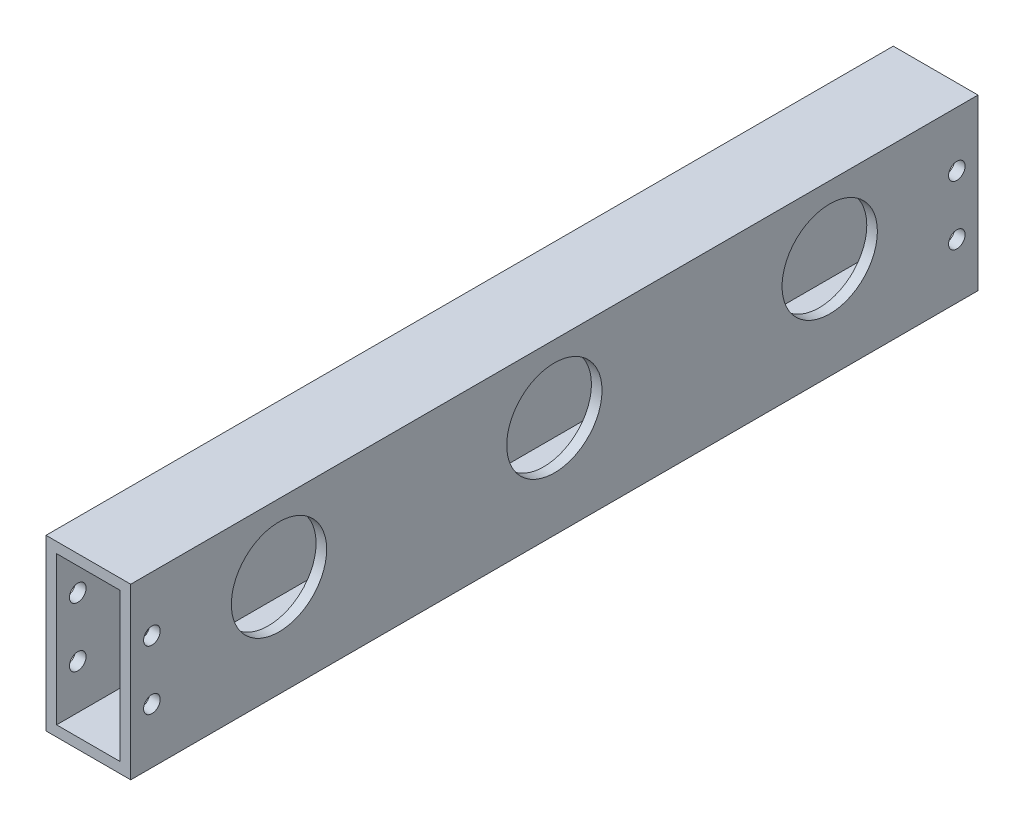
ISO-10303-21;
HEADER;
FILE_DESCRIPTION(('STEP AP214'),'2;1');
FILE_NAME('part.step','',(''),(''),'','','');
FILE_SCHEMA(('AUTOMOTIVE_DESIGN { 1 0 10303 214 1 1 1 1 }'));
ENDSEC;
DATA;
#1=APPLICATION_CONTEXT('core data for automotive mechanical design processes');
#2=APPLICATION_PROTOCOL_DEFINITION('international standard','automotive_design',2000,#1);
#3=PRODUCT_CONTEXT('',#1,'mechanical');
#4=PRODUCT('Part','Part','',(#3));
#5=PRODUCT_RELATED_PRODUCT_CATEGORY('part','',(#4));
#6=PRODUCT_DEFINITION_FORMATION('','',#4);
#7=PRODUCT_DEFINITION_CONTEXT('part definition',#1,'design');
#8=PRODUCT_DEFINITION('design','',#6,#7);
#9=PRODUCT_DEFINITION_SHAPE('','',#8);
#10=(LENGTH_UNIT() NAMED_UNIT(*) SI_UNIT(.MILLI.,.METRE.));
#11=(NAMED_UNIT(*) PLANE_ANGLE_UNIT() SI_UNIT($,.RADIAN.));
#12=(NAMED_UNIT(*) SI_UNIT($,.STERADIAN.) SOLID_ANGLE_UNIT());
#13=UNCERTAINTY_MEASURE_WITH_UNIT(LENGTH_MEASURE(1.E-05),#10,'distance_accuracy_value','');
#14=(GEOMETRIC_REPRESENTATION_CONTEXT(3) GLOBAL_UNCERTAINTY_ASSIGNED_CONTEXT((#13)) GLOBAL_UNIT_ASSIGNED_CONTEXT((#10,
#11,#12)) REPRESENTATION_CONTEXT('',''));
#15=CARTESIAN_POINT('',(0.,0.,0.));
#16=DIRECTION('',(0.,0.,1.));
#17=DIRECTION('',(1.,0.,0.));
#18=AXIS2_PLACEMENT_3D('',#15,#16,#17);
#19=CARTESIAN_POINT('',(25.4,25.4,-127.));
#20=DIRECTION('',(0.,0.,1.));
#21=DIRECTION('',(1.,0.,0.));
#22=AXIS2_PLACEMENT_3D('',#19,#20,#21);
#23=PLANE('',#22);
#24=DIRECTION('',(0.,1.,0.));
#25=VECTOR('',#24,1.);
#26=CARTESIAN_POINT('',(0.,25.4,-127.));
#27=LINE('',#26,#25);
#28=CARTESIAN_POINT('',(0.,-25.4,-127.));
#29=VERTEX_POINT('',#28);
#30=CARTESIAN_POINT('',(0.,25.4,-127.));
#31=VERTEX_POINT('',#30);
#32=EDGE_CURVE('E149',#29,#31,#27,.T.);
#33=ORIENTED_EDGE('',*,*,#32,.T.);
#34=DIRECTION('',(-1.,0.,0.));
#35=VECTOR('',#34,1.);
#36=CARTESIAN_POINT('',(25.4,25.4,-127.));
#37=LINE('',#36,#35);
#38=CARTESIAN_POINT('',(25.4,25.4,-127.));
#39=VERTEX_POINT('',#38);
#40=EDGE_CURVE('E11',#39,#31,#37,.T.);
#41=ORIENTED_EDGE('',*,*,#40,.F.);
#42=DIRECTION('',(0.,1.,0.));
#43=VECTOR('',#42,1.);
#44=CARTESIAN_POINT('',(25.4,25.4,-127.));
#45=LINE('',#44,#43);
#46=CARTESIAN_POINT('',(25.4,-25.4,-127.));
#47=VERTEX_POINT('',#46);
#48=EDGE_CURVE('E158',#47,#39,#45,.T.);
#49=ORIENTED_EDGE('',*,*,#48,.F.);
#50=DIRECTION('',(-1.,0.,0.));
#51=VECTOR('',#50,1.);
#52=CARTESIAN_POINT('',(25.4,-25.4,-127.));
#53=LINE('',#52,#51);
#54=EDGE_CURVE('E172',#47,#29,#53,.T.);
#55=ORIENTED_EDGE('',*,*,#54,.T.);
#56=EDGE_LOOP('',(#33,#41,#49,#55));
#57=FACE_BOUND('',#56,.T.);
#58=DIRECTION('',(0.,1.,0.));
#59=VECTOR('',#58,1.);
#60=CARTESIAN_POINT('',(3.175,25.4,-127.));
#61=LINE('',#60,#59);
#62=CARTESIAN_POINT('',(3.175,-22.225,-127.));
#63=VERTEX_POINT('',#62);
#64=CARTESIAN_POINT('',(3.175,22.225,-127.));
#65=VERTEX_POINT('',#64);
#66=EDGE_CURVE('E118',#63,#65,#61,.T.);
#67=ORIENTED_EDGE('',*,*,#66,.F.);
#68=DIRECTION('',(-1.,0.,0.));
#69=VECTOR('',#68,1.);
#70=CARTESIAN_POINT('',(25.4,-22.225,-127.));
#71=LINE('',#70,#69);
#72=CARTESIAN_POINT('',(22.225,-22.225,-127.));
#73=VERTEX_POINT('',#72);
#74=EDGE_CURVE('E143',#73,#63,#71,.T.);
#75=ORIENTED_EDGE('',*,*,#74,.F.);
#76=DIRECTION('',(0.,1.,0.));
#77=VECTOR('',#76,1.);
#78=CARTESIAN_POINT('',(22.225,25.4,-127.));
#79=LINE('',#78,#77);
#80=CARTESIAN_POINT('',(22.225,22.225,-127.));
#81=VERTEX_POINT('',#80);
#82=EDGE_CURVE('E62',#73,#81,#79,.T.);
#83=ORIENTED_EDGE('',*,*,#82,.T.);
#84=DIRECTION('',(-1.,0.,0.));
#85=VECTOR('',#84,1.);
#86=CARTESIAN_POINT('',(25.4,22.225,-127.));
#87=LINE('',#86,#85);
#88=EDGE_CURVE('E130',#81,#65,#87,.T.);
#89=ORIENTED_EDGE('',*,*,#88,.T.);
#90=EDGE_LOOP('',(#67,#75,#83,#89));
#91=FACE_BOUND('',#90,.T.);
#92=ADVANCED_FACE('F45',(#57,#91),#23,.F.);
#93=CARTESIAN_POINT('',(25.4,25.4,127.));
#94=DIRECTION('',(0.,0.,-1.));
#95=DIRECTION('',(-1.,0.,0.));
#96=AXIS2_PLACEMENT_3D('',#93,#94,#95);
#97=PLANE('',#96);
#98=DIRECTION('',(0.,-1.,0.));
#99=VECTOR('',#98,1.);
#100=CARTESIAN_POINT('',(0.,25.4,127.));
#101=LINE('',#100,#99);
#102=CARTESIAN_POINT('',(0.,25.4,127.));
#103=VERTEX_POINT('',#102);
#104=CARTESIAN_POINT('',(0.,-25.4,127.));
#105=VERTEX_POINT('',#104);
#106=EDGE_CURVE('E179',#103,#105,#101,.T.);
#107=ORIENTED_EDGE('',*,*,#106,.T.);
#108=DIRECTION('',(-1.,0.,0.));
#109=VECTOR('',#108,1.);
#110=CARTESIAN_POINT('',(25.4,-25.4,127.));
#111=LINE('',#110,#109);
#112=CARTESIAN_POINT('',(25.4,-25.4,127.));
#113=VERTEX_POINT('',#112);
#114=EDGE_CURVE('E187',#113,#105,#111,.T.);
#115=ORIENTED_EDGE('',*,*,#114,.F.);
#116=DIRECTION('',(0.,-1.,0.));
#117=VECTOR('',#116,1.);
#118=CARTESIAN_POINT('',(25.4,25.4,127.));
#119=LINE('',#118,#117);
#120=CARTESIAN_POINT('',(25.4,25.4,127.));
#121=VERTEX_POINT('',#120);
#122=EDGE_CURVE('E166',#121,#113,#119,.T.);
#123=ORIENTED_EDGE('',*,*,#122,.F.);
#124=DIRECTION('',(-1.,0.,0.));
#125=VECTOR('',#124,1.);
#126=CARTESIAN_POINT('',(25.4,25.4,127.));
#127=LINE('',#126,#125);
#128=EDGE_CURVE('E54',#121,#103,#127,.T.);
#129=ORIENTED_EDGE('',*,*,#128,.T.);
#130=EDGE_LOOP('',(#107,#115,#123,#129));
#131=FACE_BOUND('',#130,.T.);
#132=DIRECTION('',(0.,-1.,0.));
#133=VECTOR('',#132,1.);
#134=CARTESIAN_POINT('',(3.175,25.4,127.));
#135=LINE('',#134,#133);
#136=CARTESIAN_POINT('',(3.175,22.225,127.));
#137=VERTEX_POINT('',#136);
#138=CARTESIAN_POINT('',(3.175,-22.225,127.));
#139=VERTEX_POINT('',#138);
#140=EDGE_CURVE('E115',#137,#139,#135,.T.);
#141=ORIENTED_EDGE('',*,*,#140,.F.);
#142=DIRECTION('',(-1.,0.,0.));
#143=VECTOR('',#142,1.);
#144=CARTESIAN_POINT('',(25.4,22.225,127.));
#145=LINE('',#144,#143);
#146=CARTESIAN_POINT('',(22.225,22.225,127.));
#147=VERTEX_POINT('',#146);
#148=EDGE_CURVE('E125',#147,#137,#145,.T.);
#149=ORIENTED_EDGE('',*,*,#148,.F.);
#150=DIRECTION('',(0.,-1.,0.));
#151=VECTOR('',#150,1.);
#152=CARTESIAN_POINT('',(22.225,25.4,127.));
#153=LINE('',#152,#151);
#154=CARTESIAN_POINT('',(22.225,-22.225,127.));
#155=VERTEX_POINT('',#154);
#156=EDGE_CURVE('E67',#147,#155,#153,.T.);
#157=ORIENTED_EDGE('',*,*,#156,.T.);
#158=DIRECTION('',(-1.,0.,0.));
#159=VECTOR('',#158,1.);
#160=CARTESIAN_POINT('',(25.4,-22.225,127.));
#161=LINE('',#160,#159);
#162=EDGE_CURVE('E131',#155,#139,#161,.T.);
#163=ORIENTED_EDGE('',*,*,#162,.T.);
#164=EDGE_LOOP('',(#141,#149,#157,#163));
#165=FACE_BOUND('',#164,.T.);
#166=ADVANCED_FACE('F134',(#131,#165),#97,.F.);
#167=CARTESIAN_POINT('',(25.4,25.4,127.));
#168=DIRECTION('',(0.,-1.,0.));
#169=DIRECTION('',(0.,0.,-1.));
#170=AXIS2_PLACEMENT_3D('',#167,#168,#169);
#171=PLANE('',#170);
#172=DIRECTION('',(0.,0.,1.));
#173=VECTOR('',#172,1.);
#174=CARTESIAN_POINT('',(0.,25.4,127.));
#175=LINE('',#174,#173);
#176=EDGE_CURVE('E176',#31,#103,#175,.T.);
#177=ORIENTED_EDGE('',*,*,#176,.T.);
#178=ORIENTED_EDGE('',*,*,#128,.F.);
#179=DIRECTION('',(0.,0.,1.));
#180=VECTOR('',#179,1.);
#181=CARTESIAN_POINT('',(25.4,25.4,127.));
#182=LINE('',#181,#180);
#183=EDGE_CURVE('E162',#39,#121,#182,.T.);
#184=ORIENTED_EDGE('',*,*,#183,.F.);
#185=ORIENTED_EDGE('',*,*,#40,.T.);
#186=EDGE_LOOP('',(#177,#178,#184,#185));
#187=FACE_BOUND('',#186,.T.);
#188=ADVANCED_FACE('F306',(#187),#171,.F.);
#189=CARTESIAN_POINT('',(25.4,-25.4,127.));
#190=DIRECTION('',(0.,1.,0.));
#191=DIRECTION('',(0.,0.,1.));
#192=AXIS2_PLACEMENT_3D('',#189,#190,#191);
#193=PLANE('',#192);
#194=DIRECTION('',(0.,0.,-1.));
#195=VECTOR('',#194,1.);
#196=CARTESIAN_POINT('',(0.,-25.4,127.));
#197=LINE('',#196,#195);
#198=EDGE_CURVE('E163',#105,#29,#197,.T.);
#199=ORIENTED_EDGE('',*,*,#198,.T.);
#200=ORIENTED_EDGE('',*,*,#54,.F.);
#201=DIRECTION('',(0.,0.,-1.));
#202=VECTOR('',#201,1.);
#203=CARTESIAN_POINT('',(25.4,-25.4,127.));
#204=LINE('',#203,#202);
#205=EDGE_CURVE('E169',#113,#47,#204,.T.);
#206=ORIENTED_EDGE('',*,*,#205,.F.);
#207=ORIENTED_EDGE('',*,*,#114,.T.);
#208=EDGE_LOOP('',(#199,#200,#206,#207));
#209=FACE_BOUND('',#208,.T.);
#210=ADVANCED_FACE('F325',(#209),#193,.F.);
#211=CARTESIAN_POINT('',(25.4,0.,0.));
#212=DIRECTION('',(1.,0.,0.));
#213=DIRECTION('',(0.,0.,-1.));
#214=AXIS2_PLACEMENT_3D('',#211,#212,#213);
#215=PLANE('',#214);
#216=CARTESIAN_POINT('',(25.4,8.89,-120.65));
#217=DIRECTION('',(1.,0.,0.));
#218=DIRECTION('',(0.,0.,-1.));
#219=AXIS2_PLACEMENT_3D('',#216,#217,#218);
#220=CIRCLE('',#219,2.4892);
#221=CARTESIAN_POINT('',(25.4,8.89,-123.1392));
#222=VERTEX_POINT('',#221);
#223=EDGE_CURVE('E395',#222,#222,#220,.T.);
#224=ORIENTED_EDGE('',*,*,#223,.F.);
#225=EDGE_LOOP('',(#224));
#226=FACE_BOUND('',#225,.T.);
#227=CARTESIAN_POINT('',(25.4,-8.89,-120.65));
#228=DIRECTION('',(1.,0.,0.));
#229=DIRECTION('',(0.,0.,-1.));
#230=AXIS2_PLACEMENT_3D('',#227,#228,#229);
#231=CIRCLE('',#230,2.4892);
#232=CARTESIAN_POINT('',(25.4,-8.89,-123.1392));
#233=VERTEX_POINT('',#232);
#234=EDGE_CURVE('E227',#233,#233,#231,.T.);
#235=ORIENTED_EDGE('',*,*,#234,.F.);
#236=EDGE_LOOP('',(#235));
#237=FACE_BOUND('',#236,.T.);
#238=CARTESIAN_POINT('',(25.4,8.89,120.65));
#239=DIRECTION('',(1.,0.,0.));
#240=DIRECTION('',(0.,0.,-1.));
#241=AXIS2_PLACEMENT_3D('',#238,#239,#240);
#242=CIRCLE('',#241,2.4892);
#243=CARTESIAN_POINT('',(25.4,8.89,118.1608));
#244=VERTEX_POINT('',#243);
#245=EDGE_CURVE('E224',#244,#244,#242,.T.);
#246=ORIENTED_EDGE('',*,*,#245,.F.);
#247=EDGE_LOOP('',(#246));
#248=FACE_BOUND('',#247,.T.);
#249=CARTESIAN_POINT('',(25.4,-8.89,120.65));
#250=DIRECTION('',(1.,0.,0.));
#251=DIRECTION('',(0.,0.,-1.));
#252=AXIS2_PLACEMENT_3D('',#249,#250,#251);
#253=CIRCLE('',#252,2.4892);
#254=CARTESIAN_POINT('',(25.4,-8.89,118.1608));
#255=VERTEX_POINT('',#254);
#256=EDGE_CURVE('E246',#255,#255,#253,.T.);
#257=ORIENTED_EDGE('',*,*,#256,.F.);
#258=EDGE_LOOP('',(#257));
#259=FACE_BOUND('',#258,.T.);
#260=CARTESIAN_POINT('',(25.4,5.08,-82.55));
#261=DIRECTION('',(1.,0.,0.));
#262=DIRECTION('',(0.,0.,-1.));
#263=AXIS2_PLACEMENT_3D('',#260,#261,#262);
#264=CIRCLE('',#263,14.2875);
#265=CARTESIAN_POINT('',(25.4,5.08,-96.8375));
#266=VERTEX_POINT('',#265);
#267=EDGE_CURVE('E272',#266,#266,#264,.T.);
#268=ORIENTED_EDGE('',*,*,#267,.F.);
#269=EDGE_LOOP('',(#268));
#270=FACE_BOUND('',#269,.T.);
#271=CARTESIAN_POINT('',(25.4,5.08,82.55));
#272=DIRECTION('',(1.,0.,0.));
#273=DIRECTION('',(0.,0.,-1.));
#274=AXIS2_PLACEMENT_3D('',#271,#272,#273);
#275=CIRCLE('',#274,14.2875);
#276=CARTESIAN_POINT('',(25.4,5.08,68.2624999999999));
#277=VERTEX_POINT('',#276);
#278=EDGE_CURVE('E263',#277,#277,#275,.T.);
#279=ORIENTED_EDGE('',*,*,#278,.F.);
#280=EDGE_LOOP('',(#279));
#281=FACE_BOUND('',#280,.T.);
#282=CARTESIAN_POINT('',(25.4,5.08,0.));
#283=DIRECTION('',(1.,0.,0.));
#284=DIRECTION('',(0.,0.,-1.));
#285=AXIS2_PLACEMENT_3D('',#282,#283,#284);
#286=CIRCLE('',#285,14.2875);
#287=CARTESIAN_POINT('',(25.4,5.08,-14.2875));
#288=VERTEX_POINT('',#287);
#289=EDGE_CURVE('E267',#288,#288,#286,.T.);
#290=ORIENTED_EDGE('',*,*,#289,.F.);
#291=EDGE_LOOP('',(#290));
#292=FACE_BOUND('',#291,.T.);
#293=ORIENTED_EDGE('',*,*,#48,.T.);
#294=ORIENTED_EDGE('',*,*,#183,.T.);
#295=ORIENTED_EDGE('',*,*,#122,.T.);
#296=ORIENTED_EDGE('',*,*,#205,.T.);
#297=EDGE_LOOP('',(#293,#294,#295,#296));
#298=FACE_BOUND('',#297,.T.);
#299=ADVANCED_FACE('F321',(#226,#237,#248,#259,#270,#281,#292,#298),#215,.T.);
#300=CARTESIAN_POINT('',(0.,0.,0.));
#301=DIRECTION('',(1.,0.,0.));
#302=DIRECTION('',(0.,0.,-1.));
#303=AXIS2_PLACEMENT_3D('',#300,#301,#302);
#304=PLANE('',#303);
#305=CARTESIAN_POINT('',(0.,8.89,-120.65));
#306=DIRECTION('',(1.,0.,0.));
#307=DIRECTION('',(0.,0.,-1.));
#308=AXIS2_PLACEMENT_3D('',#305,#306,#307);
#309=CIRCLE('',#308,2.48919999999999);
#310=CARTESIAN_POINT('',(0.,8.89,-123.1392));
#311=VERTEX_POINT('',#310);
#312=EDGE_CURVE('E393',#311,#311,#309,.T.);
#313=ORIENTED_EDGE('',*,*,#312,.T.);
#314=EDGE_LOOP('',(#313));
#315=FACE_BOUND('',#314,.T.);
#316=CARTESIAN_POINT('',(0.,-8.89,-120.65));
#317=DIRECTION('',(1.,0.,0.));
#318=DIRECTION('',(0.,0.,-1.));
#319=AXIS2_PLACEMENT_3D('',#316,#317,#318);
#320=CIRCLE('',#319,2.48919999999999);
#321=CARTESIAN_POINT('',(0.,-8.89,-123.1392));
#322=VERTEX_POINT('',#321);
#323=EDGE_CURVE('E218',#322,#322,#320,.T.);
#324=ORIENTED_EDGE('',*,*,#323,.T.);
#325=EDGE_LOOP('',(#324));
#326=FACE_BOUND('',#325,.T.);
#327=CARTESIAN_POINT('',(0.,8.89,120.65));
#328=DIRECTION('',(1.,0.,0.));
#329=DIRECTION('',(0.,0.,-1.));
#330=AXIS2_PLACEMENT_3D('',#327,#328,#329);
#331=CIRCLE('',#330,2.48919999999999);
#332=CARTESIAN_POINT('',(0.,8.89,118.1608));
#333=VERTEX_POINT('',#332);
#334=EDGE_CURVE('E213',#333,#333,#331,.T.);
#335=ORIENTED_EDGE('',*,*,#334,.T.);
#336=EDGE_LOOP('',(#335));
#337=FACE_BOUND('',#336,.T.);
#338=CARTESIAN_POINT('',(0.,-8.89,120.65));
#339=DIRECTION('',(1.,0.,0.));
#340=DIRECTION('',(0.,0.,-1.));
#341=AXIS2_PLACEMENT_3D('',#338,#339,#340);
#342=CIRCLE('',#341,2.48919999999999);
#343=CARTESIAN_POINT('',(0.,-8.89,118.1608));
#344=VERTEX_POINT('',#343);
#345=EDGE_CURVE('E250',#344,#344,#342,.T.);
#346=ORIENTED_EDGE('',*,*,#345,.T.);
#347=EDGE_LOOP('',(#346));
#348=FACE_BOUND('',#347,.T.);
#349=CARTESIAN_POINT('',(0.,5.08,-82.55));
#350=DIRECTION('',(1.,0.,0.));
#351=DIRECTION('',(0.,0.,-1.));
#352=AXIS2_PLACEMENT_3D('',#349,#350,#351);
#353=CIRCLE('',#352,14.2875);
#354=CARTESIAN_POINT('',(0.,5.08,-96.8375));
#355=VERTEX_POINT('',#354);
#356=EDGE_CURVE('E262',#355,#355,#353,.T.);
#357=ORIENTED_EDGE('',*,*,#356,.T.);
#358=EDGE_LOOP('',(#357));
#359=FACE_BOUND('',#358,.T.);
#360=CARTESIAN_POINT('',(0.,5.08,82.55));
#361=DIRECTION('',(1.,0.,0.));
#362=DIRECTION('',(0.,0.,-1.));
#363=AXIS2_PLACEMENT_3D('',#360,#361,#362);
#364=CIRCLE('',#363,14.2875);
#365=CARTESIAN_POINT('',(0.,5.08,68.2624999999999));
#366=VERTEX_POINT('',#365);
#367=EDGE_CURVE('E268',#366,#366,#364,.T.);
#368=ORIENTED_EDGE('',*,*,#367,.T.);
#369=EDGE_LOOP('',(#368));
#370=FACE_BOUND('',#369,.T.);
#371=CARTESIAN_POINT('',(0.,5.08,0.));
#372=DIRECTION('',(1.,0.,0.));
#373=DIRECTION('',(0.,0.,-1.));
#374=AXIS2_PLACEMENT_3D('',#371,#372,#373);
#375=CIRCLE('',#374,14.2875);
#376=CARTESIAN_POINT('',(0.,5.08,-14.2875));
#377=VERTEX_POINT('',#376);
#378=EDGE_CURVE('E199',#377,#377,#375,.T.);
#379=ORIENTED_EDGE('',*,*,#378,.T.);
#380=EDGE_LOOP('',(#379));
#381=FACE_BOUND('',#380,.T.);
#382=ORIENTED_EDGE('',*,*,#32,.F.);
#383=ORIENTED_EDGE('',*,*,#198,.F.);
#384=ORIENTED_EDGE('',*,*,#106,.F.);
#385=ORIENTED_EDGE('',*,*,#176,.F.);
#386=EDGE_LOOP('',(#382,#383,#384,#385));
#387=FACE_BOUND('',#386,.T.);
#388=ADVANCED_FACE('F315',(#315,#326,#337,#348,#359,#370,#381,#387),#304,.F.);
#389=CARTESIAN_POINT('',(25.4,22.225,127.));
#390=DIRECTION('',(0.,-1.,0.));
#391=DIRECTION('',(0.,0.,-1.));
#392=AXIS2_PLACEMENT_3D('',#389,#390,#391);
#393=PLANE('',#392);
#394=DIRECTION('',(0.,0.,1.));
#395=VECTOR('',#394,1.);
#396=CARTESIAN_POINT('',(3.175,22.225,127.));
#397=LINE('',#396,#395);
#398=EDGE_CURVE('E111',#65,#137,#397,.T.);
#399=ORIENTED_EDGE('',*,*,#398,.F.);
#400=ORIENTED_EDGE('',*,*,#88,.F.);
#401=DIRECTION('',(0.,0.,1.));
#402=VECTOR('',#401,1.);
#403=CARTESIAN_POINT('',(22.225,22.225,127.));
#404=LINE('',#403,#402);
#405=EDGE_CURVE('E127',#81,#147,#404,.T.);
#406=ORIENTED_EDGE('',*,*,#405,.T.);
#407=ORIENTED_EDGE('',*,*,#148,.T.);
#408=EDGE_LOOP('',(#399,#400,#406,#407));
#409=FACE_BOUND('',#408,.T.);
#410=ADVANCED_FACE('F126',(#409),#393,.T.);
#411=CARTESIAN_POINT('',(25.4,-22.225,127.));
#412=DIRECTION('',(0.,1.,0.));
#413=DIRECTION('',(0.,0.,1.));
#414=AXIS2_PLACEMENT_3D('',#411,#412,#413);
#415=PLANE('',#414);
#416=DIRECTION('',(0.,0.,-1.));
#417=VECTOR('',#416,1.);
#418=CARTESIAN_POINT('',(3.175,-22.225,127.));
#419=LINE('',#418,#417);
#420=EDGE_CURVE('E136',#139,#63,#419,.T.);
#421=ORIENTED_EDGE('',*,*,#420,.F.);
#422=ORIENTED_EDGE('',*,*,#162,.F.);
#423=DIRECTION('',(0.,0.,-1.));
#424=VECTOR('',#423,1.);
#425=CARTESIAN_POINT('',(22.225,-22.225,127.));
#426=LINE('',#425,#424);
#427=EDGE_CURVE('E146',#155,#73,#426,.T.);
#428=ORIENTED_EDGE('',*,*,#427,.T.);
#429=ORIENTED_EDGE('',*,*,#74,.T.);
#430=EDGE_LOOP('',(#421,#422,#428,#429));
#431=FACE_BOUND('',#430,.T.);
#432=ADVANCED_FACE('F299',(#431),#415,.T.);
#433=CARTESIAN_POINT('',(22.225,0.,0.));
#434=DIRECTION('',(1.,0.,0.));
#435=DIRECTION('',(0.,0.,-1.));
#436=AXIS2_PLACEMENT_3D('',#433,#434,#435);
#437=PLANE('',#436);
#438=CARTESIAN_POINT('',(22.225,8.89,-120.65));
#439=DIRECTION('',(1.,0.,0.));
#440=DIRECTION('',(0.,0.,-1.));
#441=AXIS2_PLACEMENT_3D('',#438,#439,#440);
#442=CIRCLE('',#441,2.4892);
#443=CARTESIAN_POINT('',(22.225,8.89,-123.1392));
#444=VERTEX_POINT('',#443);
#445=EDGE_CURVE('E233',#444,#444,#442,.T.);
#446=ORIENTED_EDGE('',*,*,#445,.T.);
#447=EDGE_LOOP('',(#446));
#448=FACE_BOUND('',#447,.T.);
#449=CARTESIAN_POINT('',(22.225,-8.89,-120.65));
#450=DIRECTION('',(1.,0.,0.));
#451=DIRECTION('',(0.,0.,-1.));
#452=AXIS2_PLACEMENT_3D('',#449,#450,#451);
#453=CIRCLE('',#452,2.4892);
#454=CARTESIAN_POINT('',(22.225,-8.89,-123.1392));
#455=VERTEX_POINT('',#454);
#456=EDGE_CURVE('E217',#455,#455,#453,.T.);
#457=ORIENTED_EDGE('',*,*,#456,.T.);
#458=EDGE_LOOP('',(#457));
#459=FACE_BOUND('',#458,.T.);
#460=CARTESIAN_POINT('',(22.225,8.89,120.65));
#461=DIRECTION('',(1.,0.,0.));
#462=DIRECTION('',(0.,0.,-1.));
#463=AXIS2_PLACEMENT_3D('',#460,#461,#462);
#464=CIRCLE('',#463,2.4892);
#465=CARTESIAN_POINT('',(22.225,8.89,118.1608));
#466=VERTEX_POINT('',#465);
#467=EDGE_CURVE('E209',#466,#466,#464,.T.);
#468=ORIENTED_EDGE('',*,*,#467,.T.);
#469=EDGE_LOOP('',(#468));
#470=FACE_BOUND('',#469,.T.);
#471=CARTESIAN_POINT('',(22.225,-8.89,120.65));
#472=DIRECTION('',(1.,0.,0.));
#473=DIRECTION('',(0.,0.,-1.));
#474=AXIS2_PLACEMENT_3D('',#471,#472,#473);
#475=CIRCLE('',#474,2.4892);
#476=CARTESIAN_POINT('',(22.225,-8.89,118.1608));
#477=VERTEX_POINT('',#476);
#478=EDGE_CURVE('E254',#477,#477,#475,.T.);
#479=ORIENTED_EDGE('',*,*,#478,.T.);
#480=EDGE_LOOP('',(#479));
#481=FACE_BOUND('',#480,.T.);
#482=CARTESIAN_POINT('',(22.225,5.08,-82.55));
#483=DIRECTION('',(1.,0.,0.));
#484=DIRECTION('',(0.,0.,-1.));
#485=AXIS2_PLACEMENT_3D('',#482,#483,#484);
#486=CIRCLE('',#485,14.2875);
#487=CARTESIAN_POINT('',(22.225,5.08,-96.8375));
#488=VERTEX_POINT('',#487);
#489=EDGE_CURVE('E157',#488,#488,#486,.T.);
#490=ORIENTED_EDGE('',*,*,#489,.T.);
#491=EDGE_LOOP('',(#490));
#492=FACE_BOUND('',#491,.T.);
#493=CARTESIAN_POINT('',(22.225,5.08,82.55));
#494=DIRECTION('',(1.,0.,0.));
#495=DIRECTION('',(0.,0.,-1.));
#496=AXIS2_PLACEMENT_3D('',#493,#494,#495);
#497=CIRCLE('',#496,14.2875);
#498=CARTESIAN_POINT('',(22.225,5.08,68.2624999999999));
#499=VERTEX_POINT('',#498);
#500=EDGE_CURVE('E204',#499,#499,#497,.T.);
#501=ORIENTED_EDGE('',*,*,#500,.T.);
#502=EDGE_LOOP('',(#501));
#503=FACE_BOUND('',#502,.T.);
#504=CARTESIAN_POINT('',(22.225,5.08,0.));
#505=DIRECTION('',(1.,0.,0.));
#506=DIRECTION('',(0.,0.,-1.));
#507=AXIS2_PLACEMENT_3D('',#504,#505,#506);
#508=CIRCLE('',#507,14.2875);
#509=CARTESIAN_POINT('',(22.225,5.08,-14.2875));
#510=VERTEX_POINT('',#509);
#511=EDGE_CURVE('E198',#510,#510,#508,.T.);
#512=ORIENTED_EDGE('',*,*,#511,.T.);
#513=EDGE_LOOP('',(#512));
#514=FACE_BOUND('',#513,.T.);
#515=ORIENTED_EDGE('',*,*,#82,.F.);
#516=ORIENTED_EDGE('',*,*,#427,.F.);
#517=ORIENTED_EDGE('',*,*,#156,.F.);
#518=ORIENTED_EDGE('',*,*,#405,.F.);
#519=EDGE_LOOP('',(#515,#516,#517,#518));
#520=FACE_BOUND('',#519,.T.);
#521=ADVANCED_FACE('F341',(#448,#459,#470,#481,#492,#503,#514,#520),#437,.F.);
#522=CARTESIAN_POINT('',(3.175,0.,0.));
#523=DIRECTION('',(1.,0.,0.));
#524=DIRECTION('',(0.,0.,-1.));
#525=AXIS2_PLACEMENT_3D('',#522,#523,#524);
#526=PLANE('',#525);
#527=CARTESIAN_POINT('',(3.175,8.89,-120.65));
#528=DIRECTION('',(1.,0.,0.));
#529=DIRECTION('',(0.,0.,-1.));
#530=AXIS2_PLACEMENT_3D('',#527,#528,#529);
#531=CIRCLE('',#530,2.4892);
#532=CARTESIAN_POINT('',(3.175,8.89,-123.1392));
#533=VERTEX_POINT('',#532);
#534=EDGE_CURVE('E48',#533,#533,#531,.T.);
#535=ORIENTED_EDGE('',*,*,#534,.F.);
#536=EDGE_LOOP('',(#535));
#537=FACE_BOUND('',#536,.T.);
#538=CARTESIAN_POINT('',(3.175,-8.89,-120.65));
#539=DIRECTION('',(1.,0.,0.));
#540=DIRECTION('',(0.,0.,-1.));
#541=AXIS2_PLACEMENT_3D('',#538,#539,#540);
#542=CIRCLE('',#541,2.4892);
#543=CARTESIAN_POINT('',(3.175,-8.89,-123.1392));
#544=VERTEX_POINT('',#543);
#545=EDGE_CURVE('E214',#544,#544,#542,.T.);
#546=ORIENTED_EDGE('',*,*,#545,.F.);
#547=EDGE_LOOP('',(#546));
#548=FACE_BOUND('',#547,.T.);
#549=CARTESIAN_POINT('',(3.175,8.89,120.65));
#550=DIRECTION('',(1.,0.,0.));
#551=DIRECTION('',(0.,0.,-1.));
#552=AXIS2_PLACEMENT_3D('',#549,#550,#551);
#553=CIRCLE('',#552,2.4892);
#554=CARTESIAN_POINT('',(3.175,8.89,118.1608));
#555=VERTEX_POINT('',#554);
#556=EDGE_CURVE('E212',#555,#555,#553,.T.);
#557=ORIENTED_EDGE('',*,*,#556,.F.);
#558=EDGE_LOOP('',(#557));
#559=FACE_BOUND('',#558,.T.);
#560=CARTESIAN_POINT('',(3.175,-8.89,120.65));
#561=DIRECTION('',(1.,0.,0.));
#562=DIRECTION('',(0.,0.,-1.));
#563=AXIS2_PLACEMENT_3D('',#560,#561,#562);
#564=CIRCLE('',#563,2.4892);
#565=CARTESIAN_POINT('',(3.175,-8.89,118.1608));
#566=VERTEX_POINT('',#565);
#567=EDGE_CURVE('E258',#566,#566,#564,.T.);
#568=ORIENTED_EDGE('',*,*,#567,.F.);
#569=EDGE_LOOP('',(#568));
#570=FACE_BOUND('',#569,.T.);
#571=CARTESIAN_POINT('',(3.175,5.08,-82.55));
#572=DIRECTION('',(1.,0.,0.));
#573=DIRECTION('',(0.,0.,-1.));
#574=AXIS2_PLACEMENT_3D('',#571,#572,#573);
#575=CIRCLE('',#574,14.2875);
#576=CARTESIAN_POINT('',(3.175,5.08,-96.8375));
#577=VERTEX_POINT('',#576);
#578=EDGE_CURVE('E205',#577,#577,#575,.T.);
#579=ORIENTED_EDGE('',*,*,#578,.F.);
#580=EDGE_LOOP('',(#579));
#581=FACE_BOUND('',#580,.T.);
#582=CARTESIAN_POINT('',(3.175,5.08,82.55));
#583=DIRECTION('',(1.,0.,0.));
#584=DIRECTION('',(0.,0.,-1.));
#585=AXIS2_PLACEMENT_3D('',#582,#583,#584);
#586=CIRCLE('',#585,14.2875);
#587=CARTESIAN_POINT('',(3.175,5.08,68.2624999999999));
#588=VERTEX_POINT('',#587);
#589=EDGE_CURVE('E200',#588,#588,#586,.T.);
#590=ORIENTED_EDGE('',*,*,#589,.F.);
#591=EDGE_LOOP('',(#590));
#592=FACE_BOUND('',#591,.T.);
#593=CARTESIAN_POINT('',(3.175,5.08,0.));
#594=DIRECTION('',(1.,0.,0.));
#595=DIRECTION('',(0.,0.,-1.));
#596=AXIS2_PLACEMENT_3D('',#593,#594,#595);
#597=CIRCLE('',#596,14.2875);
#598=CARTESIAN_POINT('',(3.175,5.08,-14.2875));
#599=VERTEX_POINT('',#598);
#600=EDGE_CURVE('E194',#599,#599,#597,.T.);
#601=ORIENTED_EDGE('',*,*,#600,.F.);
#602=EDGE_LOOP('',(#601));
#603=FACE_BOUND('',#602,.T.);
#604=ORIENTED_EDGE('',*,*,#66,.T.);
#605=ORIENTED_EDGE('',*,*,#398,.T.);
#606=ORIENTED_EDGE('',*,*,#140,.T.);
#607=ORIENTED_EDGE('',*,*,#420,.T.);
#608=EDGE_LOOP('',(#604,#605,#606,#607));
#609=FACE_BOUND('',#608,.T.);
#610=ADVANCED_FACE('F113',(#537,#548,#559,#570,#581,#592,#603,#609),#526,.T.);
#611=CARTESIAN_POINT('',(0.,5.08,0.));
#612=DIRECTION('',(1.,0.,0.));
#613=DIRECTION('',(0.,0.,-1.));
#614=AXIS2_PLACEMENT_3D('',#611,#612,#613);
#615=CYLINDRICAL_SURFACE('',#614,14.2875);
#616=ORIENTED_EDGE('',*,*,#600,.T.);
#617=EDGE_LOOP('',(#616));
#618=FACE_BOUND('',#617,.T.);
#619=ORIENTED_EDGE('',*,*,#378,.F.);
#620=EDGE_LOOP('',(#619));
#621=FACE_BOUND('',#620,.T.);
#622=ADVANCED_FACE('F340',(#618,#621),#615,.F.);
#623=CARTESIAN_POINT('',(0.,5.08,82.55));
#624=DIRECTION('',(1.,0.,0.));
#625=DIRECTION('',(0.,0.,-1.));
#626=AXIS2_PLACEMENT_3D('',#623,#624,#625);
#627=CYLINDRICAL_SURFACE('',#626,14.2875);
#628=ORIENTED_EDGE('',*,*,#589,.T.);
#629=EDGE_LOOP('',(#628));
#630=FACE_BOUND('',#629,.T.);
#631=ORIENTED_EDGE('',*,*,#367,.F.);
#632=EDGE_LOOP('',(#631));
#633=FACE_BOUND('',#632,.T.);
#634=ADVANCED_FACE('F352',(#630,#633),#627,.F.);
#635=CARTESIAN_POINT('',(0.,5.08,-82.55));
#636=DIRECTION('',(1.,0.,0.));
#637=DIRECTION('',(0.,0.,-1.));
#638=AXIS2_PLACEMENT_3D('',#635,#636,#637);
#639=CYLINDRICAL_SURFACE('',#638,14.2875);
#640=ORIENTED_EDGE('',*,*,#578,.T.);
#641=EDGE_LOOP('',(#640));
#642=FACE_BOUND('',#641,.T.);
#643=ORIENTED_EDGE('',*,*,#356,.F.);
#644=EDGE_LOOP('',(#643));
#645=FACE_BOUND('',#644,.T.);
#646=ADVANCED_FACE('F355',(#642,#645),#639,.F.);
#647=ORIENTED_EDGE('',*,*,#289,.T.);
#648=EDGE_LOOP('',(#647));
#649=FACE_BOUND('',#648,.T.);
#650=ORIENTED_EDGE('',*,*,#511,.F.);
#651=EDGE_LOOP('',(#650));
#652=FACE_BOUND('',#651,.T.);
#653=ADVANCED_FACE('F354',(#649,#652),#615,.F.);
#654=ORIENTED_EDGE('',*,*,#278,.T.);
#655=EDGE_LOOP('',(#654));
#656=FACE_BOUND('',#655,.T.);
#657=ORIENTED_EDGE('',*,*,#500,.F.);
#658=EDGE_LOOP('',(#657));
#659=FACE_BOUND('',#658,.T.);
#660=ADVANCED_FACE('F363',(#656,#659),#627,.F.);
#661=ORIENTED_EDGE('',*,*,#267,.T.);
#662=EDGE_LOOP('',(#661));
#663=FACE_BOUND('',#662,.T.);
#664=ORIENTED_EDGE('',*,*,#489,.F.);
#665=EDGE_LOOP('',(#664));
#666=FACE_BOUND('',#665,.T.);
#667=ADVANCED_FACE('F359',(#663,#666),#639,.F.);
#668=CARTESIAN_POINT('',(25.4,-8.89,120.65));
#669=DIRECTION('',(1.,0.,0.));
#670=DIRECTION('',(0.,0.,-1.));
#671=AXIS2_PLACEMENT_3D('',#668,#669,#670);
#672=CYLINDRICAL_SURFACE('',#671,2.4892);
#673=ORIENTED_EDGE('',*,*,#567,.T.);
#674=EDGE_LOOP('',(#673));
#675=FACE_BOUND('',#674,.T.);
#676=ORIENTED_EDGE('',*,*,#345,.F.);
#677=EDGE_LOOP('',(#676));
#678=FACE_BOUND('',#677,.T.);
#679=ADVANCED_FACE('F364',(#675,#678),#672,.F.);
#680=ORIENTED_EDGE('',*,*,#256,.T.);
#681=EDGE_LOOP('',(#680));
#682=FACE_BOUND('',#681,.T.);
#683=ORIENTED_EDGE('',*,*,#478,.F.);
#684=EDGE_LOOP('',(#683));
#685=FACE_BOUND('',#684,.T.);
#686=ADVANCED_FACE('F367',(#682,#685),#672,.F.);
#687=CARTESIAN_POINT('',(25.4,8.89,120.65));
#688=DIRECTION('',(1.,0.,0.));
#689=DIRECTION('',(0.,0.,-1.));
#690=AXIS2_PLACEMENT_3D('',#687,#688,#689);
#691=CYLINDRICAL_SURFACE('',#690,2.4892);
#692=ORIENTED_EDGE('',*,*,#245,.T.);
#693=EDGE_LOOP('',(#692));
#694=FACE_BOUND('',#693,.T.);
#695=ORIENTED_EDGE('',*,*,#467,.F.);
#696=EDGE_LOOP('',(#695));
#697=FACE_BOUND('',#696,.T.);
#698=ADVANCED_FACE('F373',(#694,#697),#691,.F.);
#699=ORIENTED_EDGE('',*,*,#556,.T.);
#700=EDGE_LOOP('',(#699));
#701=FACE_BOUND('',#700,.T.);
#702=ORIENTED_EDGE('',*,*,#334,.F.);
#703=EDGE_LOOP('',(#702));
#704=FACE_BOUND('',#703,.T.);
#705=ADVANCED_FACE('F369',(#701,#704),#691,.F.);
#706=CARTESIAN_POINT('',(25.4,-8.89,-120.65));
#707=DIRECTION('',(1.,0.,0.));
#708=DIRECTION('',(0.,0.,-1.));
#709=AXIS2_PLACEMENT_3D('',#706,#707,#708);
#710=CYLINDRICAL_SURFACE('',#709,2.4892);
#711=ORIENTED_EDGE('',*,*,#545,.T.);
#712=EDGE_LOOP('',(#711));
#713=FACE_BOUND('',#712,.T.);
#714=ORIENTED_EDGE('',*,*,#323,.F.);
#715=EDGE_LOOP('',(#714));
#716=FACE_BOUND('',#715,.T.);
#717=ADVANCED_FACE('F372',(#713,#716),#710,.F.);
#718=ORIENTED_EDGE('',*,*,#234,.T.);
#719=EDGE_LOOP('',(#718));
#720=FACE_BOUND('',#719,.T.);
#721=ORIENTED_EDGE('',*,*,#456,.F.);
#722=EDGE_LOOP('',(#721));
#723=FACE_BOUND('',#722,.T.);
#724=ADVANCED_FACE('F377',(#720,#723),#710,.F.);
#725=CARTESIAN_POINT('',(25.4,8.89,-120.65));
#726=DIRECTION('',(1.,0.,0.));
#727=DIRECTION('',(0.,0.,-1.));
#728=AXIS2_PLACEMENT_3D('',#725,#726,#727);
#729=CYLINDRICAL_SURFACE('',#728,2.4892);
#730=ORIENTED_EDGE('',*,*,#534,.T.);
#731=EDGE_LOOP('',(#730));
#732=FACE_BOUND('',#731,.T.);
#733=ORIENTED_EDGE('',*,*,#312,.F.);
#734=EDGE_LOOP('',(#733));
#735=FACE_BOUND('',#734,.T.);
#736=ADVANCED_FACE('F378',(#732,#735),#729,.F.);
#737=ORIENTED_EDGE('',*,*,#223,.T.);
#738=EDGE_LOOP('',(#737));
#739=FACE_BOUND('',#738,.T.);
#740=ORIENTED_EDGE('',*,*,#445,.F.);
#741=EDGE_LOOP('',(#740));
#742=FACE_BOUND('',#741,.T.);
#743=ADVANCED_FACE('F380',(#739,#742),#729,.F.);
#744=CLOSED_SHELL('',(#92,#166,#188,#210,#299,#388,#410,#432,#521,#610,#622,#634,#646,#653,#660,
#667,#679,#686,#698,#705,#717,#724,#736,#743));
#745=MANIFOLD_SOLID_BREP('B2',#744);
#746=ADVANCED_BREP_SHAPE_REPRESENTATION('',(#18,#745),#14);
#747=SHAPE_DEFINITION_REPRESENTATION(#9,#746);
ENDSEC;
END-ISO-10303-21;
